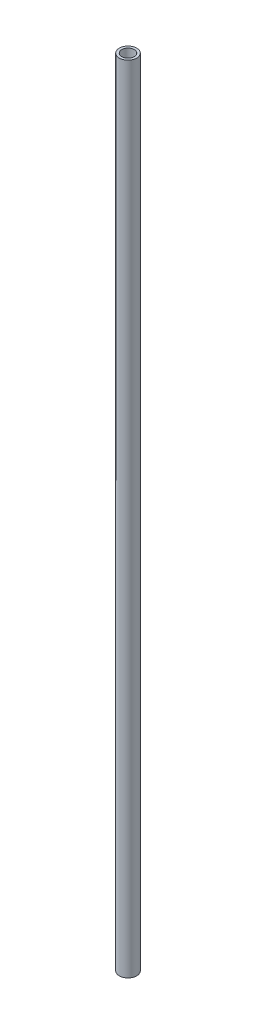
ISO-10303-21;
HEADER;
FILE_DESCRIPTION(('STEP AP214'),'2;1');
FILE_NAME('part.step','',(''),(''),'','','');
FILE_SCHEMA(('AUTOMOTIVE_DESIGN { 1 0 10303 214 1 1 1 1 }'));
ENDSEC;
DATA;
#1=APPLICATION_CONTEXT('core data for automotive mechanical design processes');
#2=APPLICATION_PROTOCOL_DEFINITION('international standard','automotive_design',2000,#1);
#3=PRODUCT_CONTEXT('',#1,'mechanical');
#4=PRODUCT('Part','Part','',(#3));
#5=PRODUCT_RELATED_PRODUCT_CATEGORY('part','',(#4));
#6=PRODUCT_DEFINITION_FORMATION('','',#4);
#7=PRODUCT_DEFINITION_CONTEXT('part definition',#1,'design');
#8=PRODUCT_DEFINITION('design','',#6,#7);
#9=PRODUCT_DEFINITION_SHAPE('','',#8);
#10=(LENGTH_UNIT() NAMED_UNIT(*) SI_UNIT(.MILLI.,.METRE.));
#11=(NAMED_UNIT(*) PLANE_ANGLE_UNIT() SI_UNIT($,.RADIAN.));
#12=(NAMED_UNIT(*) SI_UNIT($,.STERADIAN.) SOLID_ANGLE_UNIT());
#13=UNCERTAINTY_MEASURE_WITH_UNIT(LENGTH_MEASURE(1.E-05),#10,'distance_accuracy_value','');
#14=(GEOMETRIC_REPRESENTATION_CONTEXT(3) GLOBAL_UNCERTAINTY_ASSIGNED_CONTEXT((#13)) GLOBAL_UNIT_ASSIGNED_CONTEXT((#10,
#11,#12)) REPRESENTATION_CONTEXT('',''));
#15=CARTESIAN_POINT('',(0.,0.,0.));
#16=DIRECTION('',(0.,0.,1.));
#17=DIRECTION('',(1.,0.,0.));
#18=AXIS2_PLACEMENT_3D('',#15,#16,#17);
#19=CARTESIAN_POINT('',(0.,1219.2,0.));
#20=DIRECTION('',(0.,1.,0.));
#21=DIRECTION('',(0.,0.,1.));
#22=AXIS2_PLACEMENT_3D('',#19,#20,#21);
#23=PLANE('',#22);
#24=CARTESIAN_POINT('',(0.,1219.2,0.));
#25=DIRECTION('',(0.,1.,0.));
#26=DIRECTION('',(0.,0.,1.));
#27=AXIS2_PLACEMENT_3D('',#24,#25,#26);
#28=CIRCLE('',#27,13.335);
#29=CARTESIAN_POINT('',(0.,1219.2,-13.335));
#30=VERTEX_POINT('',#29);
#31=EDGE_CURVE('E10',#30,#30,#28,.T.);
#32=ORIENTED_EDGE('',*,*,#31,.T.);
#33=EDGE_LOOP('',(#32));
#34=FACE_BOUND('',#33,.T.);
#35=CARTESIAN_POINT('',(0.,1219.2,0.));
#36=DIRECTION('',(0.,1.,0.));
#37=DIRECTION('',(0.,0.,1.));
#38=AXIS2_PLACEMENT_3D('',#35,#36,#37);
#39=CIRCLE('',#38,9.525);
#40=CARTESIAN_POINT('',(0.,1219.2,-9.525));
#41=VERTEX_POINT('',#40);
#42=EDGE_CURVE('E50',#41,#41,#39,.T.);
#43=ORIENTED_EDGE('',*,*,#42,.F.);
#44=EDGE_LOOP('',(#43));
#45=FACE_BOUND('',#44,.T.);
#46=ADVANCED_FACE('F37',(#34,#45),#23,.T.);
#47=CARTESIAN_POINT('',(0.,0.,0.));
#48=DIRECTION('',(0.,1.,0.));
#49=DIRECTION('',(0.,0.,1.));
#50=AXIS2_PLACEMENT_3D('',#47,#48,#49);
#51=PLANE('',#50);
#52=CARTESIAN_POINT('',(0.,0.,0.));
#53=DIRECTION('',(0.,1.,0.));
#54=DIRECTION('',(0.,0.,1.));
#55=AXIS2_PLACEMENT_3D('',#52,#53,#54);
#56=CIRCLE('',#55,13.335);
#57=CARTESIAN_POINT('',(0.,0.,-13.335));
#58=VERTEX_POINT('',#57);
#59=EDGE_CURVE('E41',#58,#58,#56,.T.);
#60=ORIENTED_EDGE('',*,*,#59,.F.);
#61=EDGE_LOOP('',(#60));
#62=FACE_BOUND('',#61,.T.);
#63=CARTESIAN_POINT('',(0.,0.,0.));
#64=DIRECTION('',(0.,1.,0.));
#65=DIRECTION('',(0.,0.,1.));
#66=AXIS2_PLACEMENT_3D('',#63,#64,#65);
#67=CIRCLE('',#66,9.525);
#68=CARTESIAN_POINT('',(0.,0.,-9.525));
#69=VERTEX_POINT('',#68);
#70=EDGE_CURVE('E52',#69,#69,#67,.T.);
#71=ORIENTED_EDGE('',*,*,#70,.T.);
#72=EDGE_LOOP('',(#71));
#73=FACE_BOUND('',#72,.T.);
#74=ADVANCED_FACE('F64',(#62,#73),#51,.F.);
#75=CARTESIAN_POINT('',(0.,1219.2,0.));
#76=DIRECTION('',(0.,-1.,0.));
#77=DIRECTION('',(0.,0.,-1.));
#78=AXIS2_PLACEMENT_3D('',#75,#76,#77);
#79=CYLINDRICAL_SURFACE('',#78,13.335);
#80=CARTESIAN_POINT('',(0.,1219.2,-13.335));
#81=CARTESIAN_POINT('',(0.,1206.5,-13.335));
#82=CARTESIAN_POINT('',(0.,1193.8,-13.335));
#83=CARTESIAN_POINT('',(0.,1168.4,-13.335));
#84=CARTESIAN_POINT('',(0.,1155.7,-13.335));
#85=CARTESIAN_POINT('',(0.,1130.3,-13.335));
#86=CARTESIAN_POINT('',(0.,1117.6,-13.335));
#87=CARTESIAN_POINT('',(0.,1092.2,-13.335));
#88=CARTESIAN_POINT('',(0.,1079.5,-13.335));
#89=CARTESIAN_POINT('',(0.,1054.1,-13.335));
#90=CARTESIAN_POINT('',(0.,1041.4,-13.335));
#91=CARTESIAN_POINT('',(0.,1016.,-13.335));
#92=CARTESIAN_POINT('',(0.,1003.3,-13.335));
#93=CARTESIAN_POINT('',(0.,977.9,-13.335));
#94=CARTESIAN_POINT('',(0.,965.2,-13.335));
#95=CARTESIAN_POINT('',(0.,939.8,-13.335));
#96=CARTESIAN_POINT('',(0.,927.1,-13.335));
#97=CARTESIAN_POINT('',(0.,901.7,-13.335));
#98=CARTESIAN_POINT('',(0.,889.,-13.335));
#99=CARTESIAN_POINT('',(0.,863.6,-13.335));
#100=CARTESIAN_POINT('',(0.,850.9,-13.335));
#101=CARTESIAN_POINT('',(0.,825.5,-13.335));
#102=CARTESIAN_POINT('',(0.,812.8,-13.335));
#103=CARTESIAN_POINT('',(0.,787.4,-13.335));
#104=CARTESIAN_POINT('',(0.,774.7,-13.335));
#105=CARTESIAN_POINT('',(0.,749.3,-13.335));
#106=CARTESIAN_POINT('',(0.,736.6,-13.335));
#107=CARTESIAN_POINT('',(0.,711.2,-13.335));
#108=CARTESIAN_POINT('',(0.,698.5,-13.335));
#109=CARTESIAN_POINT('',(0.,673.1,-13.335));
#110=CARTESIAN_POINT('',(0.,660.4,-13.335));
#111=CARTESIAN_POINT('',(0.,635.,-13.335));
#112=CARTESIAN_POINT('',(0.,622.3,-13.335));
#113=CARTESIAN_POINT('',(0.,596.9,-13.335));
#114=CARTESIAN_POINT('',(0.,584.2,-13.335));
#115=CARTESIAN_POINT('',(0.,558.8,-13.335));
#116=CARTESIAN_POINT('',(0.,546.1,-13.335));
#117=CARTESIAN_POINT('',(0.,520.7,-13.335));
#118=CARTESIAN_POINT('',(0.,508.,-13.335));
#119=CARTESIAN_POINT('',(0.,482.6,-13.335));
#120=CARTESIAN_POINT('',(0.,469.9,-13.335));
#121=CARTESIAN_POINT('',(0.,444.5,-13.335));
#122=CARTESIAN_POINT('',(0.,431.8,-13.335));
#123=CARTESIAN_POINT('',(0.,406.4,-13.335));
#124=CARTESIAN_POINT('',(0.,393.7,-13.335));
#125=CARTESIAN_POINT('',(0.,368.3,-13.335));
#126=CARTESIAN_POINT('',(0.,355.6,-13.335));
#127=CARTESIAN_POINT('',(0.,330.2,-13.335));
#128=CARTESIAN_POINT('',(0.,317.5,-13.335));
#129=CARTESIAN_POINT('',(0.,292.1,-13.335));
#130=CARTESIAN_POINT('',(0.,279.4,-13.335));
#131=CARTESIAN_POINT('',(0.,254.,-13.335));
#132=CARTESIAN_POINT('',(0.,241.3,-13.335));
#133=CARTESIAN_POINT('',(0.,215.9,-13.335));
#134=CARTESIAN_POINT('',(0.,203.2,-13.335));
#135=CARTESIAN_POINT('',(0.,177.8,-13.335));
#136=CARTESIAN_POINT('',(0.,165.1,-13.335));
#137=CARTESIAN_POINT('',(0.,139.7,-13.335));
#138=CARTESIAN_POINT('',(0.,127.,-13.335));
#139=CARTESIAN_POINT('',(0.,101.6,-13.335));
#140=CARTESIAN_POINT('',(0.,88.9,-13.335));
#141=CARTESIAN_POINT('',(0.,63.5,-13.335));
#142=CARTESIAN_POINT('',(0.,50.8,-13.335));
#143=CARTESIAN_POINT('',(0.,25.4,-13.335));
#144=CARTESIAN_POINT('',(0.,12.7,-13.335));
#145=CARTESIAN_POINT('',(0.,0.,-13.335));
#146=B_SPLINE_CURVE_WITH_KNOTS('',3,(#80,#81,#82,#83,#84,#85,#86,#87,#88,#89,#90,#91,#92,#93,
#94,#95,#96,#97,#98,#99,#100,#101,#102,#103,#104,#105,#106,#107,#108,#109,#110,#111,#112,#113,
#114,#115,#116,#117,#118,#119,#120,#121,#122,#123,#124,#125,#126,#127,#128,#129,#130,#131,#132,
#133,#134,#135,#136,#137,#138,#139,#140,#141,#142,#143,#144,#145),.UNSPECIFIED.,.F.,.F.,(4,2,2,
2,2,2,2,2,2,2,2,2,2,2,2,2,2,2,2,2,2,2,2,2,2,2,2,2,2,2,2,2,4),(0.,38.0999999999998,
76.1999999999998,114.3,152.4,190.5,228.6,266.7,304.8,342.9,381.,419.1,457.2,495.3,533.4,571.5,
609.6,647.7,685.8,723.9,762.,800.1,838.2,876.3,914.4,952.5,990.6,1028.7,1066.8,1104.9,1143.,
1181.1,1219.2),.UNSPECIFIED.);
#147=EDGE_CURVE('BSEAM39',#30,#58,#146,.T.);
#148=ORIENTED_EDGE('',*,*,#31,.F.);
#149=ORIENTED_EDGE('',*,*,#59,.T.);
#150=ORIENTED_EDGE('',*,*,#147,.T.);
#151=ORIENTED_EDGE('',*,*,#147,.F.);
#152=EDGE_LOOP('',(#148,#150,#149,#151));
#153=FACE_BOUND('',#152,.T.);
#154=ADVANCED_FACE('F39',(#153),#79,.T.);
#155=CARTESIAN_POINT('',(0.,1219.2,0.));
#156=DIRECTION('',(0.,-1.,0.));
#157=DIRECTION('',(0.,0.,-1.));
#158=AXIS2_PLACEMENT_3D('',#155,#156,#157);
#159=CYLINDRICAL_SURFACE('',#158,9.525);
#160=CARTESIAN_POINT('',(0.,1219.2,-9.525));
#161=CARTESIAN_POINT('',(0.,1206.5,-9.525));
#162=CARTESIAN_POINT('',(0.,1193.8,-9.525));
#163=CARTESIAN_POINT('',(0.,1168.4,-9.525));
#164=CARTESIAN_POINT('',(0.,1155.7,-9.525));
#165=CARTESIAN_POINT('',(0.,1130.3,-9.525));
#166=CARTESIAN_POINT('',(0.,1117.6,-9.525));
#167=CARTESIAN_POINT('',(0.,1092.2,-9.525));
#168=CARTESIAN_POINT('',(0.,1079.5,-9.525));
#169=CARTESIAN_POINT('',(0.,1054.1,-9.525));
#170=CARTESIAN_POINT('',(0.,1041.4,-9.525));
#171=CARTESIAN_POINT('',(0.,1016.,-9.525));
#172=CARTESIAN_POINT('',(0.,1003.3,-9.525));
#173=CARTESIAN_POINT('',(0.,977.9,-9.525));
#174=CARTESIAN_POINT('',(0.,965.2,-9.525));
#175=CARTESIAN_POINT('',(0.,939.8,-9.525));
#176=CARTESIAN_POINT('',(0.,927.1,-9.525));
#177=CARTESIAN_POINT('',(0.,901.7,-9.525));
#178=CARTESIAN_POINT('',(0.,889.,-9.525));
#179=CARTESIAN_POINT('',(0.,863.6,-9.525));
#180=CARTESIAN_POINT('',(0.,850.9,-9.525));
#181=CARTESIAN_POINT('',(0.,825.5,-9.525));
#182=CARTESIAN_POINT('',(0.,812.8,-9.525));
#183=CARTESIAN_POINT('',(0.,787.4,-9.525));
#184=CARTESIAN_POINT('',(0.,774.7,-9.525));
#185=CARTESIAN_POINT('',(0.,749.3,-9.525));
#186=CARTESIAN_POINT('',(0.,736.6,-9.525));
#187=CARTESIAN_POINT('',(0.,711.2,-9.525));
#188=CARTESIAN_POINT('',(0.,698.5,-9.525));
#189=CARTESIAN_POINT('',(0.,673.1,-9.525));
#190=CARTESIAN_POINT('',(0.,660.4,-9.525));
#191=CARTESIAN_POINT('',(0.,635.,-9.525));
#192=CARTESIAN_POINT('',(0.,622.3,-9.525));
#193=CARTESIAN_POINT('',(0.,596.9,-9.525));
#194=CARTESIAN_POINT('',(0.,584.2,-9.525));
#195=CARTESIAN_POINT('',(0.,558.8,-9.525));
#196=CARTESIAN_POINT('',(0.,546.1,-9.525));
#197=CARTESIAN_POINT('',(0.,520.7,-9.525));
#198=CARTESIAN_POINT('',(0.,508.,-9.525));
#199=CARTESIAN_POINT('',(0.,482.6,-9.525));
#200=CARTESIAN_POINT('',(0.,469.9,-9.525));
#201=CARTESIAN_POINT('',(0.,444.5,-9.525));
#202=CARTESIAN_POINT('',(0.,431.8,-9.525));
#203=CARTESIAN_POINT('',(0.,406.4,-9.525));
#204=CARTESIAN_POINT('',(0.,393.7,-9.525));
#205=CARTESIAN_POINT('',(0.,368.3,-9.525));
#206=CARTESIAN_POINT('',(0.,355.6,-9.525));
#207=CARTESIAN_POINT('',(0.,330.2,-9.525));
#208=CARTESIAN_POINT('',(0.,317.5,-9.525));
#209=CARTESIAN_POINT('',(0.,292.1,-9.525));
#210=CARTESIAN_POINT('',(0.,279.4,-9.525));
#211=CARTESIAN_POINT('',(0.,254.,-9.525));
#212=CARTESIAN_POINT('',(0.,241.3,-9.525));
#213=CARTESIAN_POINT('',(0.,215.9,-9.525));
#214=CARTESIAN_POINT('',(0.,203.2,-9.525));
#215=CARTESIAN_POINT('',(0.,177.8,-9.525));
#216=CARTESIAN_POINT('',(0.,165.1,-9.525));
#217=CARTESIAN_POINT('',(0.,139.7,-9.525));
#218=CARTESIAN_POINT('',(0.,127.,-9.525));
#219=CARTESIAN_POINT('',(0.,101.6,-9.525));
#220=CARTESIAN_POINT('',(0.,88.9,-9.525));
#221=CARTESIAN_POINT('',(0.,63.5,-9.525));
#222=CARTESIAN_POINT('',(0.,50.8,-9.525));
#223=CARTESIAN_POINT('',(0.,25.4,-9.525));
#224=CARTESIAN_POINT('',(0.,12.7,-9.525));
#225=CARTESIAN_POINT('',(0.,0.,-9.525));
#226=B_SPLINE_CURVE_WITH_KNOTS('',3,(#160,#161,#162,#163,#164,#165,#166,#167,#168,#169,#170,
#171,#172,#173,#174,#175,#176,#177,#178,#179,#180,#181,#182,#183,#184,#185,#186,#187,#188,#189,
#190,#191,#192,#193,#194,#195,#196,#197,#198,#199,#200,#201,#202,#203,#204,#205,#206,#207,#208,
#209,#210,#211,#212,#213,#214,#215,#216,#217,#218,#219,#220,#221,#222,#223,#224,#225),
.UNSPECIFIED.,.F.,.F.,(4,2,2,2,2,2,2,2,2,2,2,2,2,2,2,2,2,2,2,2,2,2,2,2,2,2,2,2,2,2,2,2,4),(0.,
38.0999999999998,76.1999999999998,114.3,152.4,190.5,228.6,266.7,304.8,342.9,381.,419.1,457.2,
495.3,533.4,571.5,609.6,647.7,685.8,723.9,762.,800.1,838.2,876.3,914.4,952.5,990.6,1028.7,
1066.8,1104.9,1143.,1181.1,1219.2),.UNSPECIFIED.);
#227=EDGE_CURVE('BSEAM60',#41,#69,#226,.T.);
#228=ORIENTED_EDGE('',*,*,#42,.T.);
#229=ORIENTED_EDGE('',*,*,#70,.F.);
#230=ORIENTED_EDGE('',*,*,#227,.T.);
#231=ORIENTED_EDGE('',*,*,#227,.F.);
#232=EDGE_LOOP('',(#228,#230,#229,#231));
#233=FACE_BOUND('',#232,.T.);
#234=ADVANCED_FACE('F60',(#233),#159,.F.);
#235=CLOSED_SHELL('',(#46,#74,#154,#234));
#236=MANIFOLD_SOLID_BREP('B2',#235);
#237=ADVANCED_BREP_SHAPE_REPRESENTATION('',(#18,#236),#14);
#238=SHAPE_DEFINITION_REPRESENTATION(#9,#237);
ENDSEC;
END-ISO-10303-21;
